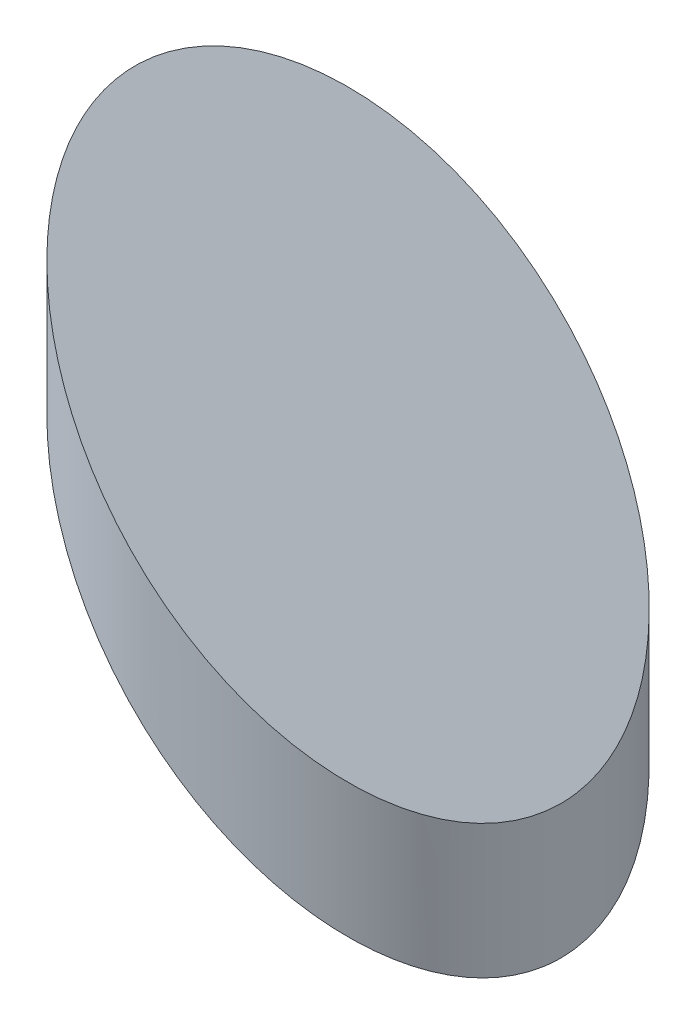
ISO-10303-21;
HEADER;
FILE_DESCRIPTION(('STEP AP214'),'2;1');
FILE_NAME('part.step','',(''),(''),'','','');
FILE_SCHEMA(('AUTOMOTIVE_DESIGN { 1 0 10303 214 1 1 1 1 }'));
ENDSEC;
DATA;
#1=APPLICATION_CONTEXT('core data for automotive mechanical design processes');
#2=APPLICATION_PROTOCOL_DEFINITION('international standard','automotive_design',2000,#1);
#3=PRODUCT_CONTEXT('',#1,'mechanical');
#4=PRODUCT('Part','Part','',(#3));
#5=PRODUCT_RELATED_PRODUCT_CATEGORY('part','',(#4));
#6=PRODUCT_DEFINITION_FORMATION('','',#4);
#7=PRODUCT_DEFINITION_CONTEXT('part definition',#1,'design');
#8=PRODUCT_DEFINITION('design','',#6,#7);
#9=PRODUCT_DEFINITION_SHAPE('','',#8);
#10=(LENGTH_UNIT() NAMED_UNIT(*) SI_UNIT(.MILLI.,.METRE.));
#11=(NAMED_UNIT(*) PLANE_ANGLE_UNIT() SI_UNIT($,.RADIAN.));
#12=(NAMED_UNIT(*) SI_UNIT($,.STERADIAN.) SOLID_ANGLE_UNIT());
#13=UNCERTAINTY_MEASURE_WITH_UNIT(LENGTH_MEASURE(1.E-05),#10,'distance_accuracy_value','');
#14=(GEOMETRIC_REPRESENTATION_CONTEXT(3) GLOBAL_UNCERTAINTY_ASSIGNED_CONTEXT((#13)) GLOBAL_UNIT_ASSIGNED_CONTEXT((#10,
#11,#12)) REPRESENTATION_CONTEXT('',''));
#15=CARTESIAN_POINT('',(0.,0.,0.));
#16=DIRECTION('',(0.,0.,1.));
#17=DIRECTION('',(1.,0.,0.));
#18=AXIS2_PLACEMENT_3D('',#15,#16,#17);
#19=CARTESIAN_POINT('',(0.,120.,0.));
#20=DIRECTION('',(0.,-1.,0.));
#21=DIRECTION('',(0.,0.,-1.));
#22=AXIS2_PLACEMENT_3D('',#19,#20,#21);
#23=CYLINDRICAL_SURFACE('',#22,45.);
#24=CARTESIAN_POINT('',(0.,73.2842712474613,0.));
#25=DIRECTION('',(-0.707106781186543,-0.707106781186552,0.));
#26=DIRECTION('',(0.707106781186552,-0.707106781186543,0.));
#27=AXIS2_PLACEMENT_3D('',#24,#25,#26);
#28=ELLIPSE('',#27,63.6396103067889,45.);
#29=CARTESIAN_POINT('',(45.,28.2842712474618,0.));
#30=VERTEX_POINT('',#29);
#31=EDGE_CURVE('E10',#30,#30,#28,.T.);
#32=ORIENTED_EDGE('',*,*,#31,.T.);
#33=EDGE_LOOP('',(#32));
#34=FACE_BOUND('',#33,.T.);
#35=CARTESIAN_POINT('',(0.,44.9999999999995,0.));
#36=DIRECTION('',(0.707106781186543,0.707106781186552,0.));
#37=DIRECTION('',(0.707106781186552,-0.707106781186543,0.));
#38=AXIS2_PLACEMENT_3D('',#35,#36,#37);
#39=ELLIPSE('',#38,63.6396103067889,45.);
#40=CARTESIAN_POINT('',(45.,0.,0.));
#41=VERTEX_POINT('',#40);
#42=EDGE_CURVE('E39',#41,#41,#39,.T.);
#43=ORIENTED_EDGE('',*,*,#42,.T.);
#44=EDGE_LOOP('',(#43));
#45=FACE_BOUND('',#44,.T.);
#46=ADVANCED_FACE('F33',(#34,#45),#23,.T.);
#47=CARTESIAN_POINT('',(45.,0.,-60.));
#48=DIRECTION('',(0.707106781186543,0.707106781186552,0.));
#49=DIRECTION('',(-0.707106781186552,0.707106781186543,0.));
#50=AXIS2_PLACEMENT_3D('',#47,#48,#49);
#51=PLANE('',#50);
#52=ORIENTED_EDGE('',*,*,#42,.F.);
#53=EDGE_LOOP('',(#52));
#54=FACE_BOUND('',#53,.T.);
#55=ADVANCED_FACE('F46',(#54),#51,.F.);
#56=CARTESIAN_POINT('',(-45.,118.284271247461,-60.));
#57=DIRECTION('',(-0.707106781186543,-0.707106781186552,0.));
#58=DIRECTION('',(0.707106781186552,-0.707106781186543,0.));
#59=AXIS2_PLACEMENT_3D('',#56,#57,#58);
#60=PLANE('',#59);
#61=ORIENTED_EDGE('',*,*,#31,.F.);
#62=EDGE_LOOP('',(#61));
#63=FACE_BOUND('',#62,.T.);
#64=ADVANCED_FACE('F48',(#63),#60,.F.);
#65=CLOSED_SHELL('',(#46,#55,#64));
#66=MANIFOLD_SOLID_BREP('B2',#65);
#67=ADVANCED_BREP_SHAPE_REPRESENTATION('',(#18,#66),#14);
#68=SHAPE_DEFINITION_REPRESENTATION(#9,#67);
ENDSEC;
END-ISO-10303-21;
